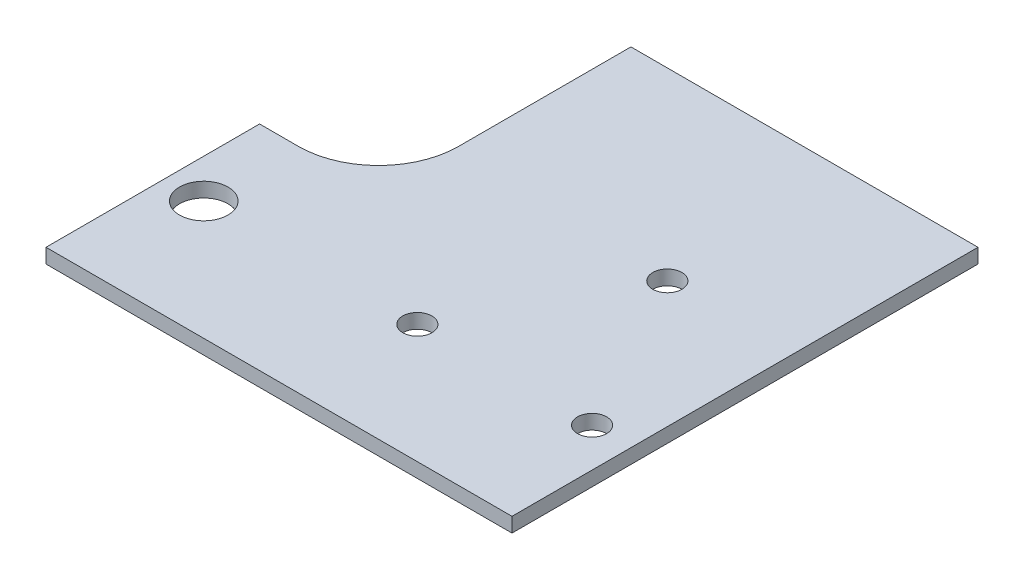
ISO-10303-21;
HEADER;
FILE_DESCRIPTION(('STEP AP214'),'2;1');
FILE_NAME('part.step','',(''),(''),'','','');
FILE_SCHEMA(('AUTOMOTIVE_DESIGN { 1 0 10303 214 1 1 1 1 }'));
ENDSEC;
DATA;
#1=APPLICATION_CONTEXT('core data for automotive mechanical design processes');
#2=APPLICATION_PROTOCOL_DEFINITION('international standard','automotive_design',2000,#1);
#3=PRODUCT_CONTEXT('',#1,'mechanical');
#4=PRODUCT('Part','Part','',(#3));
#5=PRODUCT_RELATED_PRODUCT_CATEGORY('part','',(#4));
#6=PRODUCT_DEFINITION_FORMATION('','',#4);
#7=PRODUCT_DEFINITION_CONTEXT('part definition',#1,'design');
#8=PRODUCT_DEFINITION('design','',#6,#7);
#9=PRODUCT_DEFINITION_SHAPE('','',#8);
#10=(LENGTH_UNIT() NAMED_UNIT(*) SI_UNIT(.MILLI.,.METRE.));
#11=(NAMED_UNIT(*) PLANE_ANGLE_UNIT() SI_UNIT($,.RADIAN.));
#12=(NAMED_UNIT(*) SI_UNIT($,.STERADIAN.) SOLID_ANGLE_UNIT());
#13=UNCERTAINTY_MEASURE_WITH_UNIT(LENGTH_MEASURE(1.E-05),#10,'distance_accuracy_value','');
#14=(GEOMETRIC_REPRESENTATION_CONTEXT(3) GLOBAL_UNCERTAINTY_ASSIGNED_CONTEXT((#13)) GLOBAL_UNIT_ASSIGNED_CONTEXT((#10,
#11,#12)) REPRESENTATION_CONTEXT('',''));
#15=CARTESIAN_POINT('',(0.,0.,0.));
#16=DIRECTION('',(0.,0.,1.));
#17=DIRECTION('',(1.,0.,0.));
#18=AXIS2_PLACEMENT_3D('',#15,#16,#17);
#19=CARTESIAN_POINT('',(-254.,19.05,-79.3749999999899));
#20=DIRECTION('',(0.,-1.,0.));
#21=DIRECTION('',(0.,0.,-1.));
#22=AXIS2_PLACEMENT_3D('',#19,#20,#21);
#23=CYLINDRICAL_SURFACE('',#22,104.775);
#24=CARTESIAN_POINT('',(-254.,0.,-79.3749999999899));
#25=DIRECTION('',(0.,1.,0.));
#26=DIRECTION('',(0.,0.,1.));
#27=AXIS2_PLACEMENT_3D('',#24,#25,#26);
#28=CIRCLE('',#27,104.775);
#29=CARTESIAN_POINT('',(-254.,0.,25.4000000000101));
#30=VERTEX_POINT('',#29);
#31=CARTESIAN_POINT('',(-149.225,0.,-79.3749999999898));
#32=VERTEX_POINT('',#31);
#33=EDGE_CURVE('E11',#30,#32,#28,.T.);
#34=ORIENTED_EDGE('',*,*,#33,.F.);
#35=DIRECTION('',(0.,-1.,0.));
#36=VECTOR('',#35,1.);
#37=CARTESIAN_POINT('',(-254.,19.05,25.4000000000101));
#38=LINE('',#37,#36);
#39=CARTESIAN_POINT('',(-254.,19.05,25.4000000000101));
#40=VERTEX_POINT('',#39);
#41=EDGE_CURVE('E48',#40,#30,#38,.T.);
#42=ORIENTED_EDGE('',*,*,#41,.F.);
#43=CARTESIAN_POINT('',(-254.,19.05,-79.3749999999899));
#44=DIRECTION('',(0.,-1.,0.));
#45=DIRECTION('',(0.,0.,-1.));
#46=AXIS2_PLACEMENT_3D('',#43,#44,#45);
#47=CIRCLE('',#46,104.775);
#48=CARTESIAN_POINT('',(-149.225,19.05,-79.3749999999899));
#49=VERTEX_POINT('',#48);
#50=EDGE_CURVE('E101',#49,#40,#47,.T.);
#51=ORIENTED_EDGE('',*,*,#50,.F.);
#52=DIRECTION('',(0.,-1.,0.));
#53=VECTOR('',#52,1.);
#54=CARTESIAN_POINT('',(-149.225,19.05,-79.3749999999899));
#55=LINE('',#54,#53);
#56=EDGE_CURVE('E109',#49,#32,#55,.T.);
#57=ORIENTED_EDGE('',*,*,#56,.T.);
#58=EDGE_LOOP('',(#34,#42,#51,#57));
#59=FACE_BOUND('',#58,.T.);
#60=ADVANCED_FACE('F33',(#59),#23,.F.);
#61=CARTESIAN_POINT('',(-304.8,19.05,-304.8));
#62=DIRECTION('',(1.,0.,0.));
#63=DIRECTION('',(0.,0.,-1.));
#64=AXIS2_PLACEMENT_3D('',#61,#62,#63);
#65=PLANE('',#64);
#66=DIRECTION('',(0.,0.,1.));
#67=VECTOR('',#66,1.);
#68=CARTESIAN_POINT('',(-304.8,19.05,-304.8));
#69=LINE('',#68,#67);
#70=CARTESIAN_POINT('',(-304.8,19.05,25.4000000000101));
#71=VERTEX_POINT('',#70);
#72=CARTESIAN_POINT('',(-304.8,19.05,304.8));
#73=VERTEX_POINT('',#72);
#74=EDGE_CURVE('E121',#71,#73,#69,.T.);
#75=ORIENTED_EDGE('',*,*,#74,.F.);
#76=DIRECTION('',(0.,-1.,0.));
#77=VECTOR('',#76,1.);
#78=CARTESIAN_POINT('',(-304.8,19.05,25.4000000000101));
#79=LINE('',#78,#77);
#80=CARTESIAN_POINT('',(-304.8,0.,25.4000000000101));
#81=VERTEX_POINT('',#80);
#82=EDGE_CURVE('E92',#71,#81,#79,.T.);
#83=ORIENTED_EDGE('',*,*,#82,.T.);
#84=DIRECTION('',(0.,0.,1.));
#85=VECTOR('',#84,1.);
#86=CARTESIAN_POINT('',(-304.8,0.,-304.8));
#87=LINE('',#86,#85);
#88=CARTESIAN_POINT('',(-304.8,0.,304.8));
#89=VERTEX_POINT('',#88);
#90=EDGE_CURVE('E119',#81,#89,#87,.T.);
#91=ORIENTED_EDGE('',*,*,#90,.T.);
#92=DIRECTION('',(0.,-1.,0.));
#93=VECTOR('',#92,1.);
#94=CARTESIAN_POINT('',(-304.8,19.05,304.8));
#95=LINE('',#94,#93);
#96=EDGE_CURVE('E41',#73,#89,#95,.T.);
#97=ORIENTED_EDGE('',*,*,#96,.F.);
#98=EDGE_LOOP('',(#75,#83,#91,#97));
#99=FACE_BOUND('',#98,.T.);
#100=ADVANCED_FACE('F35',(#99),#65,.F.);
#101=CARTESIAN_POINT('',(-304.8,19.05,304.8));
#102=DIRECTION('',(0.,0.,-1.));
#103=DIRECTION('',(-1.,0.,0.));
#104=AXIS2_PLACEMENT_3D('',#101,#102,#103);
#105=PLANE('',#104);
#106=DIRECTION('',(1.,0.,0.));
#107=VECTOR('',#106,1.);
#108=CARTESIAN_POINT('',(-304.8,0.,304.8));
#109=LINE('',#108,#107);
#110=CARTESIAN_POINT('',(304.8,0.,304.8));
#111=VERTEX_POINT('',#110);
#112=EDGE_CURVE('E132',#89,#111,#109,.T.);
#113=ORIENTED_EDGE('',*,*,#112,.T.);
#114=DIRECTION('',(0.,-1.,0.));
#115=VECTOR('',#114,1.);
#116=CARTESIAN_POINT('',(304.8,19.05,304.8));
#117=LINE('',#116,#115);
#118=CARTESIAN_POINT('',(304.8,19.05,304.8));
#119=VERTEX_POINT('',#118);
#120=EDGE_CURVE('E140',#119,#111,#117,.T.);
#121=ORIENTED_EDGE('',*,*,#120,.F.);
#122=DIRECTION('',(1.,0.,0.));
#123=VECTOR('',#122,1.);
#124=CARTESIAN_POINT('',(-304.8,19.05,304.8));
#125=LINE('',#124,#123);
#126=EDGE_CURVE('E123',#73,#119,#125,.T.);
#127=ORIENTED_EDGE('',*,*,#126,.F.);
#128=ORIENTED_EDGE('',*,*,#96,.T.);
#129=EDGE_LOOP('',(#113,#121,#127,#128));
#130=FACE_BOUND('',#129,.T.);
#131=ADVANCED_FACE('F146',(#130),#105,.F.);
#132=CARTESIAN_POINT('',(304.8,19.05,-304.8));
#133=DIRECTION('',(-1.,0.,0.));
#134=DIRECTION('',(0.,0.,1.));
#135=AXIS2_PLACEMENT_3D('',#132,#133,#134);
#136=PLANE('',#135);
#137=DIRECTION('',(0.,0.,-1.));
#138=VECTOR('',#137,1.);
#139=CARTESIAN_POINT('',(304.8,0.,-304.8));
#140=LINE('',#139,#138);
#141=CARTESIAN_POINT('',(304.8,0.,-304.8));
#142=VERTEX_POINT('',#141);
#143=EDGE_CURVE('E134',#111,#142,#140,.T.);
#144=ORIENTED_EDGE('',*,*,#143,.T.);
#145=DIRECTION('',(0.,-1.,0.));
#146=VECTOR('',#145,1.);
#147=CARTESIAN_POINT('',(304.8,19.05,-304.8));
#148=LINE('',#147,#146);
#149=CARTESIAN_POINT('',(304.8,19.05,-304.8));
#150=VERTEX_POINT('',#149);
#151=EDGE_CURVE('E130',#150,#142,#148,.T.);
#152=ORIENTED_EDGE('',*,*,#151,.F.);
#153=DIRECTION('',(0.,0.,-1.));
#154=VECTOR('',#153,1.);
#155=CARTESIAN_POINT('',(304.8,19.05,-304.8));
#156=LINE('',#155,#154);
#157=EDGE_CURVE('E126',#119,#150,#156,.T.);
#158=ORIENTED_EDGE('',*,*,#157,.F.);
#159=ORIENTED_EDGE('',*,*,#120,.T.);
#160=EDGE_LOOP('',(#144,#152,#158,#159));
#161=FACE_BOUND('',#160,.T.);
#162=ADVANCED_FACE('F156',(#161),#136,.F.);
#163=CARTESIAN_POINT('',(-304.8,19.05,-304.8));
#164=DIRECTION('',(0.,0.,1.));
#165=DIRECTION('',(1.,0.,0.));
#166=AXIS2_PLACEMENT_3D('',#163,#164,#165);
#167=PLANE('',#166);
#168=DIRECTION('',(-1.,0.,0.));
#169=VECTOR('',#168,1.);
#170=CARTESIAN_POINT('',(-304.8,0.,-304.8));
#171=LINE('',#170,#169);
#172=CARTESIAN_POINT('',(-149.225,0.,-304.8));
#173=VERTEX_POINT('',#172);
#174=EDGE_CURVE('E124',#142,#173,#171,.T.);
#175=ORIENTED_EDGE('',*,*,#174,.T.);
#176=DIRECTION('',(0.,-1.,0.));
#177=VECTOR('',#176,1.);
#178=CARTESIAN_POINT('',(-149.225,19.05,-304.8));
#179=LINE('',#178,#177);
#180=CARTESIAN_POINT('',(-149.225,19.05,-304.8));
#181=VERTEX_POINT('',#180);
#182=EDGE_CURVE('E114',#181,#173,#179,.T.);
#183=ORIENTED_EDGE('',*,*,#182,.F.);
#184=DIRECTION('',(-1.,0.,0.));
#185=VECTOR('',#184,1.);
#186=CARTESIAN_POINT('',(-304.8,19.05,-304.8));
#187=LINE('',#186,#185);
#188=EDGE_CURVE('E128',#150,#181,#187,.T.);
#189=ORIENTED_EDGE('',*,*,#188,.F.);
#190=ORIENTED_EDGE('',*,*,#151,.T.);
#191=EDGE_LOOP('',(#175,#183,#189,#190));
#192=FACE_BOUND('',#191,.T.);
#193=ADVANCED_FACE('F160',(#192),#167,.F.);
#194=CARTESIAN_POINT('',(-304.8,19.05,304.8));
#195=DIRECTION('',(0.,1.,0.));
#196=DIRECTION('',(0.,0.,1.));
#197=AXIS2_PLACEMENT_3D('',#194,#195,#196);
#198=PLANE('',#197);
#199=CARTESIAN_POINT('',(139.7,19.05,-63.5000000000001));
#200=DIRECTION('',(0.,-1.,0.));
#201=DIRECTION('',(0.,0.,-1.));
#202=AXIS2_PLACEMENT_3D('',#199,#200,#201);
#203=CIRCLE('',#202,19.05);
#204=CARTESIAN_POINT('',(139.7,19.05,-82.5500000000001));
#205=VERTEX_POINT('',#204);
#206=EDGE_CURVE('E179',#205,#205,#203,.T.);
#207=ORIENTED_EDGE('',*,*,#206,.T.);
#208=EDGE_LOOP('',(#207));
#209=FACE_BOUND('',#208,.T.);
#210=CARTESIAN_POINT('',(253.999999999945,19.05,149.225000000005));
#211=DIRECTION('',(0.,-1.,0.));
#212=DIRECTION('',(0.,0.,-1.));
#213=AXIS2_PLACEMENT_3D('',#210,#211,#212);
#214=CIRCLE('',#213,19.05);
#215=CARTESIAN_POINT('',(253.999999999945,19.05,130.175000000005));
#216=VERTEX_POINT('',#215);
#217=EDGE_CURVE('E173',#216,#216,#214,.T.);
#218=ORIENTED_EDGE('',*,*,#217,.T.);
#219=EDGE_LOOP('',(#218));
#220=FACE_BOUND('',#219,.T.);
#221=CARTESIAN_POINT('',(25.3999999999439,19.05,149.225000000005));
#222=DIRECTION('',(0.,-1.,0.));
#223=DIRECTION('',(0.,0.,-1.));
#224=AXIS2_PLACEMENT_3D('',#221,#222,#223);
#225=CIRCLE('',#224,19.05);
#226=CARTESIAN_POINT('',(25.3999999999439,19.05,130.175000000005));
#227=VERTEX_POINT('',#226);
#228=EDGE_CURVE('E168',#227,#227,#225,.T.);
#229=ORIENTED_EDGE('',*,*,#228,.T.);
#230=EDGE_LOOP('',(#229));
#231=FACE_BOUND('',#230,.T.);
#232=DIRECTION('',(-1.,0.,0.));
#233=VECTOR('',#232,1.);
#234=CARTESIAN_POINT('',(-254.,19.05,25.4000000000101));
#235=LINE('',#234,#233);
#236=EDGE_CURVE('E89',#40,#71,#235,.T.);
#237=ORIENTED_EDGE('',*,*,#236,.T.);
#238=ORIENTED_EDGE('',*,*,#74,.T.);
#239=ORIENTED_EDGE('',*,*,#126,.T.);
#240=ORIENTED_EDGE('',*,*,#157,.T.);
#241=ORIENTED_EDGE('',*,*,#188,.T.);
#242=DIRECTION('',(0.,0.,1.));
#243=VECTOR('',#242,1.);
#244=CARTESIAN_POINT('',(-149.225,19.05,-79.3749999999899));
#245=LINE('',#244,#243);
#246=EDGE_CURVE('E107',#181,#49,#245,.T.);
#247=ORIENTED_EDGE('',*,*,#246,.T.);
#248=ORIENTED_EDGE('',*,*,#50,.T.);
#249=EDGE_LOOP('',(#237,#238,#239,#240,#241,#247,#248));
#250=FACE_BOUND('',#249,.T.);
#251=CARTESIAN_POINT('',(-254.,19.05,149.22500000001));
#252=DIRECTION('',(0.,-1.,0.));
#253=DIRECTION('',(0.,0.,-1.));
#254=AXIS2_PLACEMENT_3D('',#251,#252,#253);
#255=CIRCLE('',#254,31.75);
#256=CARTESIAN_POINT('',(-254.,19.05,117.47500000001));
#257=VERTEX_POINT('',#256);
#258=EDGE_CURVE('E112',#257,#257,#255,.T.);
#259=ORIENTED_EDGE('',*,*,#258,.T.);
#260=EDGE_LOOP('',(#259));
#261=FACE_BOUND('',#260,.T.);
#262=ADVANCED_FACE('F104',(#209,#220,#231,#250,#261),#198,.T.);
#263=CARTESIAN_POINT('',(-304.8,0.,304.8));
#264=DIRECTION('',(0.,1.,0.));
#265=DIRECTION('',(0.,0.,1.));
#266=AXIS2_PLACEMENT_3D('',#263,#264,#265);
#267=PLANE('',#266);
#268=CARTESIAN_POINT('',(139.7,0.,-63.5000000000001));
#269=DIRECTION('',(0.,-1.,0.));
#270=DIRECTION('',(0.,0.,-1.));
#271=AXIS2_PLACEMENT_3D('',#268,#269,#270);
#272=CIRCLE('',#271,19.05);
#273=CARTESIAN_POINT('',(139.7,0.,-82.5500000000001));
#274=VERTEX_POINT('',#273);
#275=EDGE_CURVE('E182',#274,#274,#272,.T.);
#276=ORIENTED_EDGE('',*,*,#275,.F.);
#277=EDGE_LOOP('',(#276));
#278=FACE_BOUND('',#277,.T.);
#279=CARTESIAN_POINT('',(253.999999999945,0.,149.225000000005));
#280=DIRECTION('',(0.,-1.,0.));
#281=DIRECTION('',(0.,0.,-1.));
#282=AXIS2_PLACEMENT_3D('',#279,#280,#281);
#283=CIRCLE('',#282,19.05);
#284=CARTESIAN_POINT('',(253.999999999945,0.,130.175000000005));
#285=VERTEX_POINT('',#284);
#286=EDGE_CURVE('E176',#285,#285,#283,.T.);
#287=ORIENTED_EDGE('',*,*,#286,.F.);
#288=EDGE_LOOP('',(#287));
#289=FACE_BOUND('',#288,.T.);
#290=CARTESIAN_POINT('',(25.3999999999439,0.,149.225000000005));
#291=DIRECTION('',(0.,-1.,0.));
#292=DIRECTION('',(0.,0.,-1.));
#293=AXIS2_PLACEMENT_3D('',#290,#291,#292);
#294=CIRCLE('',#293,19.05);
#295=CARTESIAN_POINT('',(25.3999999999439,0.,130.175000000005));
#296=VERTEX_POINT('',#295);
#297=EDGE_CURVE('E170',#296,#296,#294,.T.);
#298=ORIENTED_EDGE('',*,*,#297,.F.);
#299=EDGE_LOOP('',(#298));
#300=FACE_BOUND('',#299,.T.);
#301=CARTESIAN_POINT('',(-254.,0.,149.22500000001));
#302=DIRECTION('',(0.,-1.,0.));
#303=DIRECTION('',(0.,0.,-1.));
#304=AXIS2_PLACEMENT_3D('',#301,#302,#303);
#305=CIRCLE('',#304,31.75);
#306=CARTESIAN_POINT('',(-254.,0.,117.47500000001));
#307=VERTEX_POINT('',#306);
#308=EDGE_CURVE('E108',#307,#307,#305,.T.);
#309=ORIENTED_EDGE('',*,*,#308,.F.);
#310=EDGE_LOOP('',(#309));
#311=FACE_BOUND('',#310,.T.);
#312=ORIENTED_EDGE('',*,*,#90,.F.);
#313=DIRECTION('',(-1.,0.,0.));
#314=VECTOR('',#313,1.);
#315=CARTESIAN_POINT('',(-254.,0.,25.4000000000101));
#316=LINE('',#315,#314);
#317=EDGE_CURVE('E96',#30,#81,#316,.T.);
#318=ORIENTED_EDGE('',*,*,#317,.F.);
#319=ORIENTED_EDGE('',*,*,#33,.T.);
#320=DIRECTION('',(0.,0.,1.));
#321=VECTOR('',#320,1.);
#322=CARTESIAN_POINT('',(-149.225,0.,-79.3749999999899));
#323=LINE('',#322,#321);
#324=EDGE_CURVE('E163',#173,#32,#323,.T.);
#325=ORIENTED_EDGE('',*,*,#324,.F.);
#326=ORIENTED_EDGE('',*,*,#174,.F.);
#327=ORIENTED_EDGE('',*,*,#143,.F.);
#328=ORIENTED_EDGE('',*,*,#112,.F.);
#329=EDGE_LOOP('',(#312,#318,#319,#325,#326,#327,#328));
#330=FACE_BOUND('',#329,.T.);
#331=ADVANCED_FACE('F152',(#278,#289,#300,#311,#330),#267,.F.);
#332=CARTESIAN_POINT('',(-254.,19.05,149.22500000001));
#333=DIRECTION('',(0.,-1.,0.));
#334=DIRECTION('',(0.,0.,-1.));
#335=AXIS2_PLACEMENT_3D('',#332,#333,#334);
#336=CYLINDRICAL_SURFACE('',#335,31.75);
#337=CARTESIAN_POINT('',(-254.,19.05,117.47500000001));
#338=CARTESIAN_POINT('',(-254.,18.8515625,117.47500000001));
#339=CARTESIAN_POINT('',(-254.,18.653125,117.47500000001));
#340=CARTESIAN_POINT('',(-254.,18.25625,117.47500000001));
#341=CARTESIAN_POINT('',(-254.,18.0578125,117.47500000001));
#342=CARTESIAN_POINT('',(-254.,17.6609375,117.47500000001));
#343=CARTESIAN_POINT('',(-254.,17.4625,117.47500000001));
#344=CARTESIAN_POINT('',(-254.,17.065625,117.47500000001));
#345=CARTESIAN_POINT('',(-254.,16.8671875,117.47500000001));
#346=CARTESIAN_POINT('',(-254.,16.4703125,117.47500000001));
#347=CARTESIAN_POINT('',(-254.,16.271875,117.47500000001));
#348=CARTESIAN_POINT('',(-254.,15.875,117.47500000001));
#349=CARTESIAN_POINT('',(-254.,15.6765625,117.47500000001));
#350=CARTESIAN_POINT('',(-254.,15.2796875,117.47500000001));
#351=CARTESIAN_POINT('',(-254.,15.08125,117.47500000001));
#352=CARTESIAN_POINT('',(-254.,14.684375,117.47500000001));
#353=CARTESIAN_POINT('',(-254.,14.4859375,117.47500000001));
#354=CARTESIAN_POINT('',(-254.,14.0890625,117.47500000001));
#355=CARTESIAN_POINT('',(-254.,13.890625,117.47500000001));
#356=CARTESIAN_POINT('',(-254.,13.49375,117.47500000001));
#357=CARTESIAN_POINT('',(-254.,13.2953125,117.47500000001));
#358=CARTESIAN_POINT('',(-254.,12.8984375,117.47500000001));
#359=CARTESIAN_POINT('',(-254.,12.7,117.47500000001));
#360=CARTESIAN_POINT('',(-254.,12.303125,117.47500000001));
#361=CARTESIAN_POINT('',(-254.,12.1046875,117.47500000001));
#362=CARTESIAN_POINT('',(-254.,11.7078125,117.47500000001));
#363=CARTESIAN_POINT('',(-254.,11.509375,117.47500000001));
#364=CARTESIAN_POINT('',(-254.,11.1125,117.47500000001));
#365=CARTESIAN_POINT('',(-254.,10.9140625,117.47500000001));
#366=CARTESIAN_POINT('',(-254.,10.5171875,117.47500000001));
#367=CARTESIAN_POINT('',(-254.,10.31875,117.47500000001));
#368=CARTESIAN_POINT('',(-254.,9.921875,117.47500000001));
#369=CARTESIAN_POINT('',(-254.,9.7234375,117.47500000001));
#370=CARTESIAN_POINT('',(-254.,9.3265625,117.47500000001));
#371=CARTESIAN_POINT('',(-254.,9.128125,117.47500000001));
#372=CARTESIAN_POINT('',(-254.,8.73125,117.47500000001));
#373=CARTESIAN_POINT('',(-254.,8.5328125,117.47500000001));
#374=CARTESIAN_POINT('',(-254.,8.1359375,117.47500000001));
#375=CARTESIAN_POINT('',(-254.,7.9375,117.47500000001));
#376=CARTESIAN_POINT('',(-254.,7.540625,117.47500000001));
#377=CARTESIAN_POINT('',(-254.,7.3421875,117.47500000001));
#378=CARTESIAN_POINT('',(-254.,6.9453125,117.47500000001));
#379=CARTESIAN_POINT('',(-254.,6.746875,117.47500000001));
#380=CARTESIAN_POINT('',(-254.,6.35,117.47500000001));
#381=CARTESIAN_POINT('',(-254.,6.1515625,117.47500000001));
#382=CARTESIAN_POINT('',(-254.,5.7546875,117.47500000001));
#383=CARTESIAN_POINT('',(-254.,5.55625,117.47500000001));
#384=CARTESIAN_POINT('',(-254.,5.159375,117.47500000001));
#385=CARTESIAN_POINT('',(-254.,4.9609375,117.47500000001));
#386=CARTESIAN_POINT('',(-254.,4.5640625,117.47500000001));
#387=CARTESIAN_POINT('',(-254.,4.365625,117.47500000001));
#388=CARTESIAN_POINT('',(-254.,3.96875,117.47500000001));
#389=CARTESIAN_POINT('',(-254.,3.7703125,117.47500000001));
#390=CARTESIAN_POINT('',(-254.,3.3734375,117.47500000001));
#391=CARTESIAN_POINT('',(-254.,3.175,117.47500000001));
#392=CARTESIAN_POINT('',(-254.,2.778125,117.47500000001));
#393=CARTESIAN_POINT('',(-254.,2.5796875,117.47500000001));
#394=CARTESIAN_POINT('',(-254.,2.1828125,117.47500000001));
#395=CARTESIAN_POINT('',(-254.,1.984375,117.47500000001));
#396=CARTESIAN_POINT('',(-254.,1.5875,117.47500000001));
#397=CARTESIAN_POINT('',(-254.,1.3890625,117.47500000001));
#398=CARTESIAN_POINT('',(-254.,0.992187500000001,117.47500000001));
#399=CARTESIAN_POINT('',(-254.,0.793750000000001,117.47500000001));
#400=CARTESIAN_POINT('',(-254.,0.396875,117.47500000001));
#401=CARTESIAN_POINT('',(-254.,0.1984375,117.47500000001));
#402=CARTESIAN_POINT('',(-254.,0.,117.47500000001));
#403=B_SPLINE_CURVE_WITH_KNOTS('',3,(#337,#338,#339,#340,#341,#342,#343,#344,#345,#346,#347,
#348,#349,#350,#351,#352,#353,#354,#355,#356,#357,#358,#359,#360,#361,#362,#363,#364,#365,#366,
#367,#368,#369,#370,#371,#372,#373,#374,#375,#376,#377,#378,#379,#380,#381,#382,#383,#384,#385,
#386,#387,#388,#389,#390,#391,#392,#393,#394,#395,#396,#397,#398,#399,#400,#401,#402),
.UNSPECIFIED.,.F.,.F.,(4,2,2,2,2,2,2,2,2,2,2,2,2,2,2,2,2,2,2,2,2,2,2,2,2,2,2,2,2,2,2,2,4),(0.,
0.5953125,1.190625,1.7859375,2.38125,2.9765625,3.571875,4.1671875,4.7625,5.3578125,5.953125,
6.5484375,7.14375,7.7390625,8.334375,8.9296875,9.525,10.1203125,10.715625,11.3109375,11.90625,
12.5015625,13.096875,13.6921875,14.2875,14.8828125,15.478125,16.0734375,16.66875,17.2640625,
17.859375,18.4546875,19.05),.UNSPECIFIED.);
#404=EDGE_CURVE('BSEAM199',#257,#307,#403,.T.);
#405=ORIENTED_EDGE('',*,*,#258,.F.);
#406=ORIENTED_EDGE('',*,*,#308,.T.);
#407=ORIENTED_EDGE('',*,*,#404,.T.);
#408=ORIENTED_EDGE('',*,*,#404,.F.);
#409=EDGE_LOOP('',(#405,#407,#406,#408));
#410=FACE_BOUND('',#409,.T.);
#411=ADVANCED_FACE('F199',(#410),#336,.F.);
#412=CARTESIAN_POINT('',(-149.225,19.05,-79.3749999999899));
#413=DIRECTION('',(1.,0.,0.));
#414=DIRECTION('',(0.,0.,-1.));
#415=AXIS2_PLACEMENT_3D('',#412,#413,#414);
#416=PLANE('',#415);
#417=ORIENTED_EDGE('',*,*,#324,.T.);
#418=ORIENTED_EDGE('',*,*,#56,.F.);
#419=ORIENTED_EDGE('',*,*,#246,.F.);
#420=ORIENTED_EDGE('',*,*,#182,.T.);
#421=EDGE_LOOP('',(#417,#418,#419,#420));
#422=FACE_BOUND('',#421,.T.);
#423=ADVANCED_FACE('F208',(#422),#416,.F.);
#424=CARTESIAN_POINT('',(-254.,19.05,25.4000000000101));
#425=DIRECTION('',(0.,0.,1.));
#426=DIRECTION('',(1.,0.,0.));
#427=AXIS2_PLACEMENT_3D('',#424,#425,#426);
#428=PLANE('',#427);
#429=ORIENTED_EDGE('',*,*,#236,.F.);
#430=ORIENTED_EDGE('',*,*,#41,.T.);
#431=ORIENTED_EDGE('',*,*,#317,.T.);
#432=ORIENTED_EDGE('',*,*,#82,.F.);
#433=EDGE_LOOP('',(#429,#430,#431,#432));
#434=FACE_BOUND('',#433,.T.);
#435=ADVANCED_FACE('F90',(#434),#428,.F.);
#436=CARTESIAN_POINT('',(25.3999999999439,19.05,149.225000000005));
#437=DIRECTION('',(0.,-1.,0.));
#438=DIRECTION('',(0.,0.,-1.));
#439=AXIS2_PLACEMENT_3D('',#436,#437,#438);
#440=CYLINDRICAL_SURFACE('',#439,19.05);
#441=CARTESIAN_POINT('',(25.3999999999439,19.05,130.175000000005));
#442=CARTESIAN_POINT('',(25.3999999999439,18.8515625,130.175000000005));
#443=CARTESIAN_POINT('',(25.3999999999439,18.653125,130.175000000005));
#444=CARTESIAN_POINT('',(25.3999999999439,18.25625,130.175000000005));
#445=CARTESIAN_POINT('',(25.3999999999439,18.0578125,130.175000000005));
#446=CARTESIAN_POINT('',(25.3999999999439,17.6609375,130.175000000005));
#447=CARTESIAN_POINT('',(25.3999999999439,17.4625,130.175000000005));
#448=CARTESIAN_POINT('',(25.3999999999439,17.065625,130.175000000005));
#449=CARTESIAN_POINT('',(25.3999999999439,16.8671875,130.175000000005));
#450=CARTESIAN_POINT('',(25.3999999999439,16.4703125,130.175000000005));
#451=CARTESIAN_POINT('',(25.3999999999439,16.271875,130.175000000005));
#452=CARTESIAN_POINT('',(25.3999999999439,15.875,130.175000000005));
#453=CARTESIAN_POINT('',(25.3999999999439,15.6765625,130.175000000005));
#454=CARTESIAN_POINT('',(25.3999999999439,15.2796875,130.175000000005));
#455=CARTESIAN_POINT('',(25.3999999999439,15.08125,130.175000000005));
#456=CARTESIAN_POINT('',(25.3999999999439,14.684375,130.175000000005));
#457=CARTESIAN_POINT('',(25.3999999999439,14.4859375,130.175000000005));
#458=CARTESIAN_POINT('',(25.3999999999439,14.0890625,130.175000000005));
#459=CARTESIAN_POINT('',(25.3999999999439,13.890625,130.175000000005));
#460=CARTESIAN_POINT('',(25.3999999999439,13.49375,130.175000000005));
#461=CARTESIAN_POINT('',(25.3999999999439,13.2953125,130.175000000005));
#462=CARTESIAN_POINT('',(25.3999999999439,12.8984375,130.175000000005));
#463=CARTESIAN_POINT('',(25.3999999999439,12.7,130.175000000005));
#464=CARTESIAN_POINT('',(25.3999999999439,12.303125,130.175000000005));
#465=CARTESIAN_POINT('',(25.3999999999439,12.1046875,130.175000000005));
#466=CARTESIAN_POINT('',(25.3999999999439,11.7078125,130.175000000005));
#467=CARTESIAN_POINT('',(25.3999999999439,11.509375,130.175000000005));
#468=CARTESIAN_POINT('',(25.3999999999439,11.1125,130.175000000005));
#469=CARTESIAN_POINT('',(25.3999999999439,10.9140625,130.175000000005));
#470=CARTESIAN_POINT('',(25.3999999999439,10.5171875,130.175000000005));
#471=CARTESIAN_POINT('',(25.3999999999439,10.31875,130.175000000005));
#472=CARTESIAN_POINT('',(25.3999999999439,9.921875,130.175000000005));
#473=CARTESIAN_POINT('',(25.3999999999439,9.7234375,130.175000000005));
#474=CARTESIAN_POINT('',(25.3999999999439,9.3265625,130.175000000005));
#475=CARTESIAN_POINT('',(25.3999999999439,9.128125,130.175000000005));
#476=CARTESIAN_POINT('',(25.3999999999439,8.73125,130.175000000005));
#477=CARTESIAN_POINT('',(25.3999999999439,8.5328125,130.175000000005));
#478=CARTESIAN_POINT('',(25.3999999999439,8.1359375,130.175000000005));
#479=CARTESIAN_POINT('',(25.3999999999439,7.9375,130.175000000005));
#480=CARTESIAN_POINT('',(25.3999999999439,7.540625,130.175000000005));
#481=CARTESIAN_POINT('',(25.3999999999439,7.3421875,130.175000000005));
#482=CARTESIAN_POINT('',(25.3999999999439,6.9453125,130.175000000005));
#483=CARTESIAN_POINT('',(25.3999999999439,6.746875,130.175000000005));
#484=CARTESIAN_POINT('',(25.3999999999439,6.35,130.175000000005));
#485=CARTESIAN_POINT('',(25.3999999999439,6.1515625,130.175000000005));
#486=CARTESIAN_POINT('',(25.3999999999439,5.7546875,130.175000000005));
#487=CARTESIAN_POINT('',(25.3999999999439,5.55625,130.175000000005));
#488=CARTESIAN_POINT('',(25.3999999999439,5.159375,130.175000000005));
#489=CARTESIAN_POINT('',(25.3999999999439,4.9609375,130.175000000005));
#490=CARTESIAN_POINT('',(25.3999999999439,4.5640625,130.175000000005));
#491=CARTESIAN_POINT('',(25.3999999999439,4.365625,130.175000000005));
#492=CARTESIAN_POINT('',(25.3999999999439,3.96875,130.175000000005));
#493=CARTESIAN_POINT('',(25.3999999999439,3.7703125,130.175000000005));
#494=CARTESIAN_POINT('',(25.3999999999439,3.3734375,130.175000000005));
#495=CARTESIAN_POINT('',(25.3999999999439,3.175,130.175000000005));
#496=CARTESIAN_POINT('',(25.3999999999439,2.778125,130.175000000005));
#497=CARTESIAN_POINT('',(25.3999999999439,2.5796875,130.175000000005));
#498=CARTESIAN_POINT('',(25.3999999999439,2.1828125,130.175000000005));
#499=CARTESIAN_POINT('',(25.3999999999439,1.984375,130.175000000005));
#500=CARTESIAN_POINT('',(25.3999999999439,1.5875,130.175000000005));
#501=CARTESIAN_POINT('',(25.3999999999439,1.3890625,130.175000000005));
#502=CARTESIAN_POINT('',(25.3999999999439,0.992187500000001,130.175000000005));
#503=CARTESIAN_POINT('',(25.3999999999439,0.793750000000001,130.175000000005));
#504=CARTESIAN_POINT('',(25.3999999999439,0.396875,130.175000000005));
#505=CARTESIAN_POINT('',(25.3999999999439,0.1984375,130.175000000005));
#506=CARTESIAN_POINT('',(25.3999999999439,0.,130.175000000005));
#507=B_SPLINE_CURVE_WITH_KNOTS('',3,(#441,#442,#443,#444,#445,#446,#447,#448,#449,#450,#451,
#452,#453,#454,#455,#456,#457,#458,#459,#460,#461,#462,#463,#464,#465,#466,#467,#468,#469,#470,
#471,#472,#473,#474,#475,#476,#477,#478,#479,#480,#481,#482,#483,#484,#485,#486,#487,#488,#489,
#490,#491,#492,#493,#494,#495,#496,#497,#498,#499,#500,#501,#502,#503,#504,#505,#506),
.UNSPECIFIED.,.F.,.F.,(4,2,2,2,2,2,2,2,2,2,2,2,2,2,2,2,2,2,2,2,2,2,2,2,2,2,2,2,2,2,2,2,4),(0.,
0.5953125,1.190625,1.7859375,2.38125,2.9765625,3.571875,4.1671875,4.7625,5.3578125,5.953125,
6.5484375,7.14375,7.7390625,8.334375,8.9296875,9.525,10.1203125,10.715625,11.3109375,11.90625,
12.5015625,13.096875,13.6921875,14.2875,14.8828125,15.478125,16.0734375,16.66875,17.2640625,
17.859375,18.4546875,19.05),.UNSPECIFIED.);
#508=EDGE_CURVE('BSEAM225',#227,#296,#507,.T.);
#509=ORIENTED_EDGE('',*,*,#228,.F.);
#510=ORIENTED_EDGE('',*,*,#297,.T.);
#511=ORIENTED_EDGE('',*,*,#508,.T.);
#512=ORIENTED_EDGE('',*,*,#508,.F.);
#513=EDGE_LOOP('',(#509,#511,#510,#512));
#514=FACE_BOUND('',#513,.T.);
#515=ADVANCED_FACE('F225',(#514),#440,.F.);
#516=CARTESIAN_POINT('',(253.999999999945,19.05,149.225000000005));
#517=DIRECTION('',(0.,-1.,0.));
#518=DIRECTION('',(0.,0.,-1.));
#519=AXIS2_PLACEMENT_3D('',#516,#517,#518);
#520=CYLINDRICAL_SURFACE('',#519,19.05);
#521=CARTESIAN_POINT('',(253.999999999945,19.05,130.175000000005));
#522=CARTESIAN_POINT('',(253.999999999945,18.8515625,130.175000000005));
#523=CARTESIAN_POINT('',(253.999999999945,18.653125,130.175000000005));
#524=CARTESIAN_POINT('',(253.999999999945,18.25625,130.175000000005));
#525=CARTESIAN_POINT('',(253.999999999945,18.0578125,130.175000000005));
#526=CARTESIAN_POINT('',(253.999999999945,17.6609375,130.175000000005));
#527=CARTESIAN_POINT('',(253.999999999945,17.4625,130.175000000005));
#528=CARTESIAN_POINT('',(253.999999999945,17.065625,130.175000000005));
#529=CARTESIAN_POINT('',(253.999999999945,16.8671875,130.175000000005));
#530=CARTESIAN_POINT('',(253.999999999945,16.4703125,130.175000000005));
#531=CARTESIAN_POINT('',(253.999999999945,16.271875,130.175000000005));
#532=CARTESIAN_POINT('',(253.999999999945,15.875,130.175000000005));
#533=CARTESIAN_POINT('',(253.999999999945,15.6765625,130.175000000005));
#534=CARTESIAN_POINT('',(253.999999999945,15.2796875,130.175000000005));
#535=CARTESIAN_POINT('',(253.999999999945,15.08125,130.175000000005));
#536=CARTESIAN_POINT('',(253.999999999945,14.684375,130.175000000005));
#537=CARTESIAN_POINT('',(253.999999999945,14.4859375,130.175000000005));
#538=CARTESIAN_POINT('',(253.999999999945,14.0890625,130.175000000005));
#539=CARTESIAN_POINT('',(253.999999999945,13.890625,130.175000000005));
#540=CARTESIAN_POINT('',(253.999999999945,13.49375,130.175000000005));
#541=CARTESIAN_POINT('',(253.999999999945,13.2953125,130.175000000005));
#542=CARTESIAN_POINT('',(253.999999999945,12.8984375,130.175000000005));
#543=CARTESIAN_POINT('',(253.999999999945,12.7,130.175000000005));
#544=CARTESIAN_POINT('',(253.999999999945,12.303125,130.175000000005));
#545=CARTESIAN_POINT('',(253.999999999945,12.1046875,130.175000000005));
#546=CARTESIAN_POINT('',(253.999999999945,11.7078125,130.175000000005));
#547=CARTESIAN_POINT('',(253.999999999945,11.509375,130.175000000005));
#548=CARTESIAN_POINT('',(253.999999999945,11.1125,130.175000000005));
#549=CARTESIAN_POINT('',(253.999999999945,10.9140625,130.175000000005));
#550=CARTESIAN_POINT('',(253.999999999945,10.5171875,130.175000000005));
#551=CARTESIAN_POINT('',(253.999999999945,10.31875,130.175000000005));
#552=CARTESIAN_POINT('',(253.999999999945,9.921875,130.175000000005));
#553=CARTESIAN_POINT('',(253.999999999945,9.7234375,130.175000000005));
#554=CARTESIAN_POINT('',(253.999999999945,9.3265625,130.175000000005));
#555=CARTESIAN_POINT('',(253.999999999945,9.128125,130.175000000005));
#556=CARTESIAN_POINT('',(253.999999999945,8.73125,130.175000000005));
#557=CARTESIAN_POINT('',(253.999999999945,8.5328125,130.175000000005));
#558=CARTESIAN_POINT('',(253.999999999945,8.1359375,130.175000000005));
#559=CARTESIAN_POINT('',(253.999999999945,7.9375,130.175000000005));
#560=CARTESIAN_POINT('',(253.999999999945,7.540625,130.175000000005));
#561=CARTESIAN_POINT('',(253.999999999945,7.3421875,130.175000000005));
#562=CARTESIAN_POINT('',(253.999999999945,6.9453125,130.175000000005));
#563=CARTESIAN_POINT('',(253.999999999945,6.746875,130.175000000005));
#564=CARTESIAN_POINT('',(253.999999999945,6.35,130.175000000005));
#565=CARTESIAN_POINT('',(253.999999999945,6.1515625,130.175000000005));
#566=CARTESIAN_POINT('',(253.999999999945,5.7546875,130.175000000005));
#567=CARTESIAN_POINT('',(253.999999999945,5.55625,130.175000000005));
#568=CARTESIAN_POINT('',(253.999999999945,5.159375,130.175000000005));
#569=CARTESIAN_POINT('',(253.999999999945,4.9609375,130.175000000005));
#570=CARTESIAN_POINT('',(253.999999999945,4.5640625,130.175000000005));
#571=CARTESIAN_POINT('',(253.999999999945,4.365625,130.175000000005));
#572=CARTESIAN_POINT('',(253.999999999945,3.96875,130.175000000005));
#573=CARTESIAN_POINT('',(253.999999999945,3.7703125,130.175000000005));
#574=CARTESIAN_POINT('',(253.999999999945,3.3734375,130.175000000005));
#575=CARTESIAN_POINT('',(253.999999999945,3.175,130.175000000005));
#576=CARTESIAN_POINT('',(253.999999999945,2.778125,130.175000000005));
#577=CARTESIAN_POINT('',(253.999999999945,2.5796875,130.175000000005));
#578=CARTESIAN_POINT('',(253.999999999945,2.1828125,130.175000000005));
#579=CARTESIAN_POINT('',(253.999999999945,1.984375,130.175000000005));
#580=CARTESIAN_POINT('',(253.999999999945,1.5875,130.175000000005));
#581=CARTESIAN_POINT('',(253.999999999945,1.3890625,130.175000000005));
#582=CARTESIAN_POINT('',(253.999999999945,0.992187500000001,130.175000000005));
#583=CARTESIAN_POINT('',(253.999999999945,0.793750000000001,130.175000000005));
#584=CARTESIAN_POINT('',(253.999999999945,0.396875,130.175000000005));
#585=CARTESIAN_POINT('',(253.999999999945,0.1984375,130.175000000005));
#586=CARTESIAN_POINT('',(253.999999999945,0.,130.175000000005));
#587=B_SPLINE_CURVE_WITH_KNOTS('',3,(#521,#522,#523,#524,#525,#526,#527,#528,#529,#530,#531,
#532,#533,#534,#535,#536,#537,#538,#539,#540,#541,#542,#543,#544,#545,#546,#547,#548,#549,#550,
#551,#552,#553,#554,#555,#556,#557,#558,#559,#560,#561,#562,#563,#564,#565,#566,#567,#568,#569,
#570,#571,#572,#573,#574,#575,#576,#577,#578,#579,#580,#581,#582,#583,#584,#585,#586),
.UNSPECIFIED.,.F.,.F.,(4,2,2,2,2,2,2,2,2,2,2,2,2,2,2,2,2,2,2,2,2,2,2,2,2,2,2,2,2,2,2,2,4),(0.,
0.5953125,1.190625,1.7859375,2.38125,2.9765625,3.571875,4.1671875,4.7625,5.3578125,5.953125,
6.5484375,7.14375,7.7390625,8.334375,8.9296875,9.525,10.1203125,10.715625,11.3109375,11.90625,
12.5015625,13.096875,13.6921875,14.2875,14.8828125,15.478125,16.0734375,16.66875,17.2640625,
17.859375,18.4546875,19.05),.UNSPECIFIED.);
#588=EDGE_CURVE('BSEAM193',#216,#285,#587,.T.);
#589=ORIENTED_EDGE('',*,*,#217,.F.);
#590=ORIENTED_EDGE('',*,*,#286,.T.);
#591=ORIENTED_EDGE('',*,*,#588,.T.);
#592=ORIENTED_EDGE('',*,*,#588,.F.);
#593=EDGE_LOOP('',(#589,#591,#590,#592));
#594=FACE_BOUND('',#593,.T.);
#595=ADVANCED_FACE('F193',(#594),#520,.F.);
#596=CARTESIAN_POINT('',(139.7,19.05,-63.5000000000001));
#597=DIRECTION('',(0.,-1.,0.));
#598=DIRECTION('',(0.,0.,-1.));
#599=AXIS2_PLACEMENT_3D('',#596,#597,#598);
#600=CYLINDRICAL_SURFACE('',#599,19.05);
#601=CARTESIAN_POINT('',(139.7,19.05,-82.5500000000001));
#602=CARTESIAN_POINT('',(139.7,18.8515625,-82.5500000000001));
#603=CARTESIAN_POINT('',(139.7,18.653125,-82.5500000000001));
#604=CARTESIAN_POINT('',(139.7,18.25625,-82.5500000000001));
#605=CARTESIAN_POINT('',(139.7,18.0578125,-82.5500000000001));
#606=CARTESIAN_POINT('',(139.7,17.6609375,-82.5500000000001));
#607=CARTESIAN_POINT('',(139.7,17.4625,-82.5500000000001));
#608=CARTESIAN_POINT('',(139.7,17.065625,-82.5500000000001));
#609=CARTESIAN_POINT('',(139.7,16.8671875,-82.5500000000001));
#610=CARTESIAN_POINT('',(139.7,16.4703125,-82.5500000000001));
#611=CARTESIAN_POINT('',(139.7,16.271875,-82.5500000000001));
#612=CARTESIAN_POINT('',(139.7,15.875,-82.5500000000001));
#613=CARTESIAN_POINT('',(139.7,15.6765625,-82.5500000000001));
#614=CARTESIAN_POINT('',(139.7,15.2796875,-82.5500000000001));
#615=CARTESIAN_POINT('',(139.7,15.08125,-82.5500000000001));
#616=CARTESIAN_POINT('',(139.7,14.684375,-82.5500000000001));
#617=CARTESIAN_POINT('',(139.7,14.4859375,-82.5500000000001));
#618=CARTESIAN_POINT('',(139.7,14.0890625,-82.5500000000001));
#619=CARTESIAN_POINT('',(139.7,13.890625,-82.5500000000001));
#620=CARTESIAN_POINT('',(139.7,13.49375,-82.5500000000001));
#621=CARTESIAN_POINT('',(139.7,13.2953125,-82.5500000000001));
#622=CARTESIAN_POINT('',(139.7,12.8984375,-82.5500000000001));
#623=CARTESIAN_POINT('',(139.7,12.7,-82.5500000000001));
#624=CARTESIAN_POINT('',(139.7,12.303125,-82.5500000000001));
#625=CARTESIAN_POINT('',(139.7,12.1046875,-82.5500000000001));
#626=CARTESIAN_POINT('',(139.7,11.7078125,-82.5500000000001));
#627=CARTESIAN_POINT('',(139.7,11.509375,-82.5500000000001));
#628=CARTESIAN_POINT('',(139.7,11.1125,-82.5500000000001));
#629=CARTESIAN_POINT('',(139.7,10.9140625,-82.5500000000001));
#630=CARTESIAN_POINT('',(139.7,10.5171875,-82.5500000000001));
#631=CARTESIAN_POINT('',(139.7,10.31875,-82.5500000000001));
#632=CARTESIAN_POINT('',(139.7,9.921875,-82.5500000000001));
#633=CARTESIAN_POINT('',(139.7,9.7234375,-82.5500000000001));
#634=CARTESIAN_POINT('',(139.7,9.3265625,-82.5500000000001));
#635=CARTESIAN_POINT('',(139.7,9.128125,-82.5500000000001));
#636=CARTESIAN_POINT('',(139.7,8.73125,-82.5500000000001));
#637=CARTESIAN_POINT('',(139.7,8.5328125,-82.5500000000001));
#638=CARTESIAN_POINT('',(139.7,8.1359375,-82.5500000000001));
#639=CARTESIAN_POINT('',(139.7,7.9375,-82.5500000000001));
#640=CARTESIAN_POINT('',(139.7,7.540625,-82.5500000000001));
#641=CARTESIAN_POINT('',(139.7,7.3421875,-82.5500000000001));
#642=CARTESIAN_POINT('',(139.7,6.9453125,-82.5500000000001));
#643=CARTESIAN_POINT('',(139.7,6.746875,-82.5500000000001));
#644=CARTESIAN_POINT('',(139.7,6.35,-82.5500000000001));
#645=CARTESIAN_POINT('',(139.7,6.1515625,-82.5500000000001));
#646=CARTESIAN_POINT('',(139.7,5.7546875,-82.5500000000001));
#647=CARTESIAN_POINT('',(139.7,5.55625,-82.5500000000001));
#648=CARTESIAN_POINT('',(139.7,5.159375,-82.5500000000001));
#649=CARTESIAN_POINT('',(139.7,4.9609375,-82.5500000000001));
#650=CARTESIAN_POINT('',(139.7,4.5640625,-82.5500000000001));
#651=CARTESIAN_POINT('',(139.7,4.365625,-82.5500000000001));
#652=CARTESIAN_POINT('',(139.7,3.96875,-82.5500000000001));
#653=CARTESIAN_POINT('',(139.7,3.7703125,-82.5500000000001));
#654=CARTESIAN_POINT('',(139.7,3.3734375,-82.5500000000001));
#655=CARTESIAN_POINT('',(139.7,3.175,-82.5500000000001));
#656=CARTESIAN_POINT('',(139.7,2.778125,-82.5500000000001));
#657=CARTESIAN_POINT('',(139.7,2.5796875,-82.5500000000001));
#658=CARTESIAN_POINT('',(139.7,2.1828125,-82.5500000000001));
#659=CARTESIAN_POINT('',(139.7,1.984375,-82.5500000000001));
#660=CARTESIAN_POINT('',(139.7,1.5875,-82.5500000000001));
#661=CARTESIAN_POINT('',(139.7,1.3890625,-82.5500000000001));
#662=CARTESIAN_POINT('',(139.7,0.992187500000001,-82.5500000000001));
#663=CARTESIAN_POINT('',(139.7,0.793750000000001,-82.5500000000001));
#664=CARTESIAN_POINT('',(139.7,0.396875,-82.5500000000001));
#665=CARTESIAN_POINT('',(139.7,0.1984375,-82.5500000000001));
#666=CARTESIAN_POINT('',(139.7,0.,-82.5500000000001));
#667=B_SPLINE_CURVE_WITH_KNOTS('',3,(#601,#602,#603,#604,#605,#606,#607,#608,#609,#610,#611,
#612,#613,#614,#615,#616,#617,#618,#619,#620,#621,#622,#623,#624,#625,#626,#627,#628,#629,#630,
#631,#632,#633,#634,#635,#636,#637,#638,#639,#640,#641,#642,#643,#644,#645,#646,#647,#648,#649,
#650,#651,#652,#653,#654,#655,#656,#657,#658,#659,#660,#661,#662,#663,#664,#665,#666),
.UNSPECIFIED.,.F.,.F.,(4,2,2,2,2,2,2,2,2,2,2,2,2,2,2,2,2,2,2,2,2,2,2,2,2,2,2,2,2,2,2,2,4),(0.,
0.5953125,1.190625,1.7859375,2.38125,2.9765625,3.571875,4.1671875,4.7625,5.3578125,5.953125,
6.5484375,7.14375,7.7390625,8.334375,8.9296875,9.525,10.1203125,10.715625,11.3109375,11.90625,
12.5015625,13.096875,13.6921875,14.2875,14.8828125,15.478125,16.0734375,16.66875,17.2640625,
17.859375,18.4546875,19.05),.UNSPECIFIED.);
#668=EDGE_CURVE('BSEAM190',#205,#274,#667,.T.);
#669=ORIENTED_EDGE('',*,*,#206,.F.);
#670=ORIENTED_EDGE('',*,*,#275,.T.);
#671=ORIENTED_EDGE('',*,*,#668,.T.);
#672=ORIENTED_EDGE('',*,*,#668,.F.);
#673=EDGE_LOOP('',(#669,#671,#670,#672));
#674=FACE_BOUND('',#673,.T.);
#675=ADVANCED_FACE('F190',(#674),#600,.F.);
#676=CLOSED_SHELL('',(#60,#100,#131,#162,#193,#262,#331,#411,#423,#435,#515,#595,#675));
#677=MANIFOLD_SOLID_BREP('B2',#676);
#678=ADVANCED_BREP_SHAPE_REPRESENTATION('',(#18,#677),#14);
#679=SHAPE_DEFINITION_REPRESENTATION(#9,#678);
ENDSEC;
END-ISO-10303-21;
